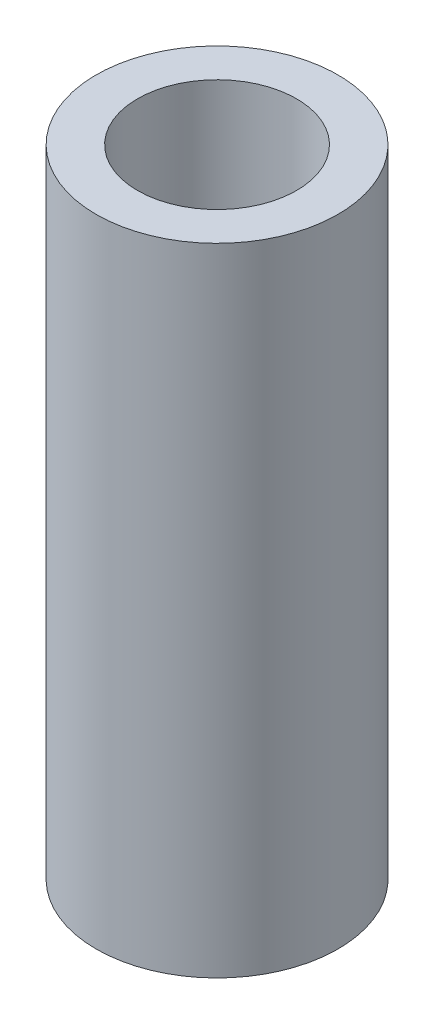
ISO-10303-21;
HEADER;
FILE_DESCRIPTION(('STEP AP214'),'2;1');
FILE_NAME('part.step','',(''),(''),'','','');
FILE_SCHEMA(('AUTOMOTIVE_DESIGN { 1 0 10303 214 1 1 1 1 }'));
ENDSEC;
DATA;
#1=APPLICATION_CONTEXT('core data for automotive mechanical design processes');
#2=APPLICATION_PROTOCOL_DEFINITION('international standard','automotive_design',2000,#1);
#3=PRODUCT_CONTEXT('',#1,'mechanical');
#4=PRODUCT('Part','Part','',(#3));
#5=PRODUCT_RELATED_PRODUCT_CATEGORY('part','',(#4));
#6=PRODUCT_DEFINITION_FORMATION('','',#4);
#7=PRODUCT_DEFINITION_CONTEXT('part definition',#1,'design');
#8=PRODUCT_DEFINITION('design','',#6,#7);
#9=PRODUCT_DEFINITION_SHAPE('','',#8);
#10=(LENGTH_UNIT() NAMED_UNIT(*) SI_UNIT(.MILLI.,.METRE.));
#11=(NAMED_UNIT(*) PLANE_ANGLE_UNIT() SI_UNIT($,.RADIAN.));
#12=(NAMED_UNIT(*) SI_UNIT($,.STERADIAN.) SOLID_ANGLE_UNIT());
#13=UNCERTAINTY_MEASURE_WITH_UNIT(LENGTH_MEASURE(1.E-05),#10,'distance_accuracy_value','');
#14=(GEOMETRIC_REPRESENTATION_CONTEXT(3) GLOBAL_UNCERTAINTY_ASSIGNED_CONTEXT((#13)) GLOBAL_UNIT_ASSIGNED_CONTEXT((#10,
#11,#12)) REPRESENTATION_CONTEXT('',''));
#15=CARTESIAN_POINT('',(0.,0.,0.));
#16=DIRECTION('',(0.,0.,1.));
#17=DIRECTION('',(1.,0.,0.));
#18=AXIS2_PLACEMENT_3D('',#15,#16,#17);
#19=CARTESIAN_POINT('',(0.,50.,0.));
#20=DIRECTION('',(0.,1.,0.));
#21=DIRECTION('',(0.,0.,1.));
#22=AXIS2_PLACEMENT_3D('',#19,#20,#21);
#23=PLANE('',#22);
#24=CARTESIAN_POINT('',(0.,50.,0.));
#25=DIRECTION('',(0.,1.,0.));
#26=DIRECTION('',(0.,0.,1.));
#27=AXIS2_PLACEMENT_3D('',#24,#25,#26);
#28=CIRCLE('',#27,9.5);
#29=CARTESIAN_POINT('',(0.,50.,9.5));
#30=VERTEX_POINT('',#29);
#31=EDGE_CURVE('E10',#30,#30,#28,.T.);
#32=ORIENTED_EDGE('',*,*,#31,.T.);
#33=EDGE_LOOP('',(#32));
#34=FACE_BOUND('',#33,.T.);
#35=CARTESIAN_POINT('',(0.,50.,0.));
#36=DIRECTION('',(0.,1.,0.));
#37=DIRECTION('',(0.,0.,1.));
#38=AXIS2_PLACEMENT_3D('',#35,#36,#37);
#39=CIRCLE('',#38,6.25);
#40=CARTESIAN_POINT('',(0.,50.,6.25));
#41=VERTEX_POINT('',#40);
#42=EDGE_CURVE('E42',#41,#41,#39,.T.);
#43=ORIENTED_EDGE('',*,*,#42,.F.);
#44=EDGE_LOOP('',(#43));
#45=FACE_BOUND('',#44,.T.);
#46=ADVANCED_FACE('F31',(#34,#45),#23,.T.);
#47=CARTESIAN_POINT('',(0.,0.,0.));
#48=DIRECTION('',(0.,1.,0.));
#49=DIRECTION('',(0.,0.,1.));
#50=AXIS2_PLACEMENT_3D('',#47,#48,#49);
#51=PLANE('',#50);
#52=CARTESIAN_POINT('',(0.,0.,0.));
#53=DIRECTION('',(0.,1.,0.));
#54=DIRECTION('',(0.,0.,1.));
#55=AXIS2_PLACEMENT_3D('',#52,#53,#54);
#56=CIRCLE('',#55,9.5);
#57=CARTESIAN_POINT('',(0.,0.,9.5));
#58=VERTEX_POINT('',#57);
#59=EDGE_CURVE('E35',#58,#58,#56,.T.);
#60=ORIENTED_EDGE('',*,*,#59,.F.);
#61=EDGE_LOOP('',(#60));
#62=FACE_BOUND('',#61,.T.);
#63=CARTESIAN_POINT('',(0.,0.,0.));
#64=DIRECTION('',(0.,1.,0.));
#65=DIRECTION('',(0.,0.,1.));
#66=AXIS2_PLACEMENT_3D('',#63,#64,#65);
#67=CIRCLE('',#66,6.25);
#68=CARTESIAN_POINT('',(0.,0.,6.25));
#69=VERTEX_POINT('',#68);
#70=EDGE_CURVE('E44',#69,#69,#67,.T.);
#71=ORIENTED_EDGE('',*,*,#70,.T.);
#72=EDGE_LOOP('',(#71));
#73=FACE_BOUND('',#72,.T.);
#74=ADVANCED_FACE('F54',(#62,#73),#51,.F.);
#75=CARTESIAN_POINT('',(0.,50.,0.));
#76=DIRECTION('',(0.,-1.,0.));
#77=DIRECTION('',(0.,0.,-1.));
#78=AXIS2_PLACEMENT_3D('',#75,#76,#77);
#79=CYLINDRICAL_SURFACE('',#78,9.5);
#80=ORIENTED_EDGE('',*,*,#31,.F.);
#81=EDGE_LOOP('',(#80));
#82=FACE_BOUND('',#81,.T.);
#83=ORIENTED_EDGE('',*,*,#59,.T.);
#84=EDGE_LOOP('',(#83));
#85=FACE_BOUND('',#84,.T.);
#86=ADVANCED_FACE('F33',(#82,#85),#79,.T.);
#87=CARTESIAN_POINT('',(0.,50.,0.));
#88=DIRECTION('',(0.,-1.,0.));
#89=DIRECTION('',(0.,0.,-1.));
#90=AXIS2_PLACEMENT_3D('',#87,#88,#89);
#91=CYLINDRICAL_SURFACE('',#90,6.25);
#92=ORIENTED_EDGE('',*,*,#42,.T.);
#93=EDGE_LOOP('',(#92));
#94=FACE_BOUND('',#93,.T.);
#95=ORIENTED_EDGE('',*,*,#70,.F.);
#96=EDGE_LOOP('',(#95));
#97=FACE_BOUND('',#96,.T.);
#98=ADVANCED_FACE('F50',(#94,#97),#91,.F.);
#99=CLOSED_SHELL('',(#46,#74,#86,#98));
#100=MANIFOLD_SOLID_BREP('B2',#99);
#101=ADVANCED_BREP_SHAPE_REPRESENTATION('',(#18,#100),#14);
#102=SHAPE_DEFINITION_REPRESENTATION(#9,#101);
ENDSEC;
END-ISO-10303-21;
